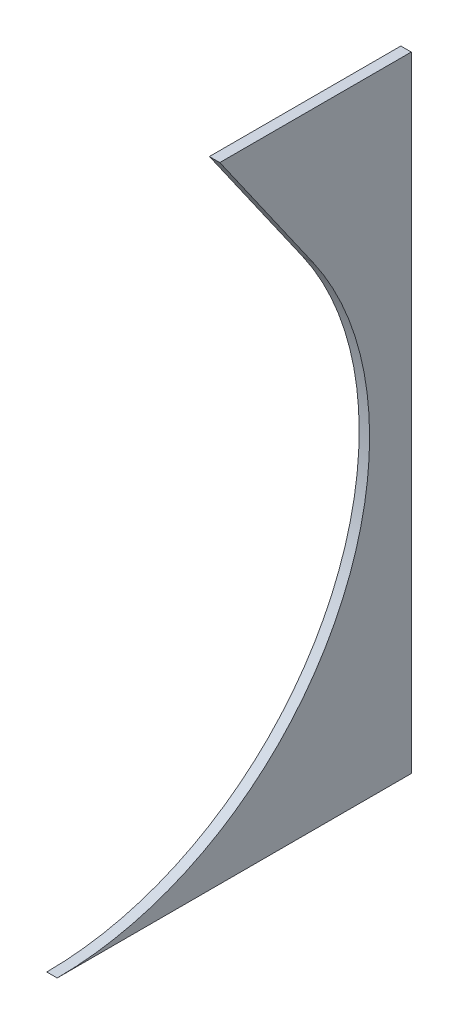
ISO-10303-21;
HEADER;
FILE_DESCRIPTION(('STEP AP214'),'2;1');
FILE_NAME('part.step','',(''),(''),'','','');
FILE_SCHEMA(('AUTOMOTIVE_DESIGN { 1 0 10303 214 1 1 1 1 }'));
ENDSEC;
DATA;
#1=APPLICATION_CONTEXT('core data for automotive mechanical design processes');
#2=APPLICATION_PROTOCOL_DEFINITION('international standard','automotive_design',2000,#1);
#3=PRODUCT_CONTEXT('',#1,'mechanical');
#4=PRODUCT('Part','Part','',(#3));
#5=PRODUCT_RELATED_PRODUCT_CATEGORY('part','',(#4));
#6=PRODUCT_DEFINITION_FORMATION('','',#4);
#7=PRODUCT_DEFINITION_CONTEXT('part definition',#1,'design');
#8=PRODUCT_DEFINITION('design','',#6,#7);
#9=PRODUCT_DEFINITION_SHAPE('','',#8);
#10=(LENGTH_UNIT() NAMED_UNIT(*) SI_UNIT(.MILLI.,.METRE.));
#11=(NAMED_UNIT(*) PLANE_ANGLE_UNIT() SI_UNIT($,.RADIAN.));
#12=(NAMED_UNIT(*) SI_UNIT($,.STERADIAN.) SOLID_ANGLE_UNIT());
#13=UNCERTAINTY_MEASURE_WITH_UNIT(LENGTH_MEASURE(1.E-05),#10,'distance_accuracy_value','');
#14=(GEOMETRIC_REPRESENTATION_CONTEXT(3) GLOBAL_UNCERTAINTY_ASSIGNED_CONTEXT((#13)) GLOBAL_UNIT_ASSIGNED_CONTEXT((#10,
#11,#12)) REPRESENTATION_CONTEXT('',''));
#15=CARTESIAN_POINT('',(0.,0.,0.));
#16=DIRECTION('',(0.,0.,1.));
#17=DIRECTION('',(1.,0.,0.));
#18=AXIS2_PLACEMENT_3D('',#15,#16,#17);
#19=CARTESIAN_POINT('',(6.35,-168.088235294118,-120.65));
#20=DIRECTION('',(0.,0.,1.));
#21=DIRECTION('',(1.,0.,0.));
#22=AXIS2_PLACEMENT_3D('',#19,#20,#21);
#23=PLANE('',#22);
#24=DIRECTION('',(0.,1.,0.));
#25=VECTOR('',#24,1.);
#26=CARTESIAN_POINT('',(0.,-168.088235294118,-120.65));
#27=LINE('',#26,#25);
#28=CARTESIAN_POINT('',(0.,-168.088235294118,-120.65));
#29=VERTEX_POINT('',#28);
#30=CARTESIAN_POINT('',(0.,212.911764705882,-120.65));
#31=VERTEX_POINT('',#30);
#32=EDGE_CURVE('E89',#29,#31,#27,.T.);
#33=ORIENTED_EDGE('',*,*,#32,.T.);
#34=DIRECTION('',(-1.,0.,0.));
#35=VECTOR('',#34,1.);
#36=CARTESIAN_POINT('',(6.35,212.911764705882,-120.65));
#37=LINE('',#36,#35);
#38=CARTESIAN_POINT('',(6.35,212.911764705882,-120.65));
#39=VERTEX_POINT('',#38);
#40=EDGE_CURVE('E42',#39,#31,#37,.T.);
#41=ORIENTED_EDGE('',*,*,#40,.F.);
#42=DIRECTION('',(0.,1.,0.));
#43=VECTOR('',#42,1.);
#44=CARTESIAN_POINT('',(6.35,-168.088235294118,-120.65));
#45=LINE('',#44,#43);
#46=CARTESIAN_POINT('',(6.35,-168.088235294118,-120.65));
#47=VERTEX_POINT('',#46);
#48=EDGE_CURVE('E83',#47,#39,#45,.T.);
#49=ORIENTED_EDGE('',*,*,#48,.F.);
#50=DIRECTION('',(-1.,0.,0.));
#51=VECTOR('',#50,1.);
#52=CARTESIAN_POINT('',(6.35,-168.088235294118,-120.65));
#53=LINE('',#52,#51);
#54=EDGE_CURVE('E75',#47,#29,#53,.T.);
#55=ORIENTED_EDGE('',*,*,#54,.T.);
#56=EDGE_LOOP('',(#33,#41,#49,#55));
#57=FACE_BOUND('',#56,.T.);
#58=ADVANCED_FACE('F35',(#57),#23,.F.);
#59=CARTESIAN_POINT('',(6.35,212.911764705882,95.2500000000001));
#60=DIRECTION('',(0.,-1.,0.));
#61=DIRECTION('',(0.,0.,-1.));
#62=AXIS2_PLACEMENT_3D('',#59,#60,#61);
#63=PLANE('',#62);
#64=DIRECTION('',(0.,0.,1.));
#65=VECTOR('',#64,1.);
#66=CARTESIAN_POINT('',(0.,212.911764705882,95.2500000000001));
#67=LINE('',#66,#65);
#68=CARTESIAN_POINT('',(0.,212.911764705882,-3.91802313010686));
#69=VERTEX_POINT('',#68);
#70=EDGE_CURVE('E84',#31,#69,#67,.T.);
#71=ORIENTED_EDGE('',*,*,#70,.T.);
#72=DIRECTION('',(1.,0.,0.));
#73=VECTOR('',#72,1.);
#74=CARTESIAN_POINT('',(6.35,212.911764705882,-3.91802313010686));
#75=LINE('',#74,#73);
#76=CARTESIAN_POINT('',(6.35,212.911764705882,-3.91802313010686));
#77=VERTEX_POINT('',#76);
#78=EDGE_CURVE('E98',#69,#77,#75,.T.);
#79=ORIENTED_EDGE('',*,*,#78,.T.);
#80=DIRECTION('',(0.,0.,1.));
#81=VECTOR('',#80,1.);
#82=CARTESIAN_POINT('',(6.35,212.911764705882,95.2500000000001));
#83=LINE('',#82,#81);
#84=EDGE_CURVE('E108',#39,#77,#83,.T.);
#85=ORIENTED_EDGE('',*,*,#84,.F.);
#86=ORIENTED_EDGE('',*,*,#40,.T.);
#87=EDGE_LOOP('',(#71,#79,#85,#86));
#88=FACE_BOUND('',#87,.T.);
#89=ADVANCED_FACE('F104',(#88),#63,.F.);
#90=CARTESIAN_POINT('',(6.35,-168.088235294118,95.2500000000001));
#91=DIRECTION('',(0.,1.,0.));
#92=DIRECTION('',(0.,0.,1.));
#93=AXIS2_PLACEMENT_3D('',#90,#91,#92);
#94=PLANE('',#93);
#95=DIRECTION('',(0.,0.,-1.));
#96=VECTOR('',#95,1.);
#97=CARTESIAN_POINT('',(0.,-168.088235294118,95.2500000000001));
#98=LINE('',#97,#96);
#99=CARTESIAN_POINT('',(0.,-168.088235294118,95.2500000000001));
#100=VERTEX_POINT('',#99);
#101=EDGE_CURVE('E72',#100,#29,#98,.T.);
#102=ORIENTED_EDGE('',*,*,#101,.T.);
#103=ORIENTED_EDGE('',*,*,#54,.F.);
#104=DIRECTION('',(0.,0.,-1.));
#105=VECTOR('',#104,1.);
#106=CARTESIAN_POINT('',(6.35,-168.088235294118,95.2500000000001));
#107=LINE('',#106,#105);
#108=CARTESIAN_POINT('',(6.35,-168.088235294118,95.2500000000001));
#109=VERTEX_POINT('',#108);
#110=EDGE_CURVE('E58',#109,#47,#107,.T.);
#111=ORIENTED_EDGE('',*,*,#110,.F.);
#112=DIRECTION('',(-1.,0.,0.));
#113=VECTOR('',#112,1.);
#114=CARTESIAN_POINT('',(6.35,-168.088235294118,95.2500000000001));
#115=LINE('',#114,#113);
#116=EDGE_CURVE('E79',#109,#100,#115,.T.);
#117=ORIENTED_EDGE('',*,*,#116,.T.);
#118=EDGE_LOOP('',(#102,#103,#111,#117));
#119=FACE_BOUND('',#118,.T.);
#120=ADVANCED_FACE('F74',(#119),#94,.F.);
#121=CARTESIAN_POINT('',(6.35,0.,0.));
#122=DIRECTION('',(-1.,0.,0.));
#123=DIRECTION('',(0.,0.,1.));
#124=AXIS2_PLACEMENT_3D('',#121,#122,#123);
#125=PLANE('',#124);
#126=ORIENTED_EDGE('',*,*,#84,.T.);
#127=DIRECTION('',(0.,0.819152044288989,0.573576436351051));
#128=VECTOR('',#127,1.);
#129=CARTESIAN_POINT('',(6.35,131.678075830757,-60.7984644370522));
#130=LINE('',#129,#128);
#131=CARTESIAN_POINT('',(6.35,131.678075830757,-60.7984644370522));
#132=VERTEX_POINT('',#131);
#133=EDGE_CURVE('E117',#132,#77,#130,.T.);
#134=ORIENTED_EDGE('',*,*,#133,.F.);
#135=CARTESIAN_POINT('',(6.35,22.4117647058822,95.2500000000001));
#136=DIRECTION('',(1.,0.,0.));
#137=DIRECTION('',(0.,0.,-1.));
#138=AXIS2_PLACEMENT_3D('',#135,#136,#137);
#139=CIRCLE('',#138,190.5);
#140=EDGE_CURVE('E94',#109,#132,#139,.T.);
#141=ORIENTED_EDGE('',*,*,#140,.F.);
#142=ORIENTED_EDGE('',*,*,#110,.T.);
#143=ORIENTED_EDGE('',*,*,#48,.T.);
#144=EDGE_LOOP('',(#126,#134,#141,#142,#143));
#145=FACE_BOUND('',#144,.T.);
#146=ADVANCED_FACE('F111',(#145),#125,.F.);
#147=CARTESIAN_POINT('',(0.,0.,0.));
#148=DIRECTION('',(-1.,0.,0.));
#149=DIRECTION('',(0.,0.,1.));
#150=AXIS2_PLACEMENT_3D('',#147,#148,#149);
#151=PLANE('',#150);
#152=DIRECTION('',(0.,0.819152044288989,0.573576436351051));
#153=VECTOR('',#152,1.);
#154=CARTESIAN_POINT('',(0.,131.678075830757,-60.7984644370522));
#155=LINE('',#154,#153);
#156=CARTESIAN_POINT('',(0.,131.678075830757,-60.7984644370523));
#157=VERTEX_POINT('',#156);
#158=EDGE_CURVE('E49',#157,#69,#155,.T.);
#159=ORIENTED_EDGE('',*,*,#158,.T.);
#160=ORIENTED_EDGE('',*,*,#70,.F.);
#161=ORIENTED_EDGE('',*,*,#32,.F.);
#162=ORIENTED_EDGE('',*,*,#101,.F.);
#163=CARTESIAN_POINT('',(0.,22.4117647058822,95.2500000000001));
#164=DIRECTION('',(-1.,0.,0.));
#165=DIRECTION('',(0.,0.,1.));
#166=AXIS2_PLACEMENT_3D('',#163,#164,#165);
#167=CIRCLE('',#166,190.5);
#168=EDGE_CURVE('E11',#157,#100,#167,.T.);
#169=ORIENTED_EDGE('',*,*,#168,.F.);
#170=EDGE_LOOP('',(#159,#160,#161,#162,#169));
#171=FACE_BOUND('',#170,.T.);
#172=ADVANCED_FACE('F91',(#171),#151,.T.);
#173=CARTESIAN_POINT('',(0.,22.4117647058822,95.2500000000001));
#174=DIRECTION('',(1.,0.,0.));
#175=DIRECTION('',(0.,0.,-1.));
#176=AXIS2_PLACEMENT_3D('',#173,#174,#175);
#177=CYLINDRICAL_SURFACE('',#176,190.5);
#178=ORIENTED_EDGE('',*,*,#140,.T.);
#179=DIRECTION('',(1.,0.,0.));
#180=VECTOR('',#179,1.);
#181=CARTESIAN_POINT('',(0.,131.678075830757,-60.7984644370522));
#182=LINE('',#181,#180);
#183=EDGE_CURVE('E115',#157,#132,#182,.T.);
#184=ORIENTED_EDGE('',*,*,#183,.F.);
#185=ORIENTED_EDGE('',*,*,#168,.T.);
#186=ORIENTED_EDGE('',*,*,#116,.F.);
#187=EDGE_LOOP('',(#178,#184,#185,#186));
#188=FACE_BOUND('',#187,.T.);
#189=ADVANCED_FACE('F126',(#188),#177,.F.);
#190=CARTESIAN_POINT('',(0.,131.678075830757,-60.7984644370522));
#191=DIRECTION('',(0.,0.573576436351051,-0.819152044288988));
#192=DIRECTION('',(0.,0.819152044288989,0.573576436351051));
#193=AXIS2_PLACEMENT_3D('',#190,#191,#192);
#194=PLANE('',#193);
#195=ORIENTED_EDGE('',*,*,#158,.F.);
#196=ORIENTED_EDGE('',*,*,#183,.T.);
#197=ORIENTED_EDGE('',*,*,#133,.T.);
#198=ORIENTED_EDGE('',*,*,#78,.F.);
#199=EDGE_LOOP('',(#195,#196,#197,#198));
#200=FACE_BOUND('',#199,.T.);
#201=ADVANCED_FACE('F127',(#200),#194,.F.);
#202=CLOSED_SHELL('',(#58,#89,#120,#146,#172,#189,#201));
#203=MANIFOLD_SOLID_BREP('B2',#202);
#204=ADVANCED_BREP_SHAPE_REPRESENTATION('',(#18,#203),#14);
#205=SHAPE_DEFINITION_REPRESENTATION(#9,#204);
ENDSEC;
END-ISO-10303-21;
